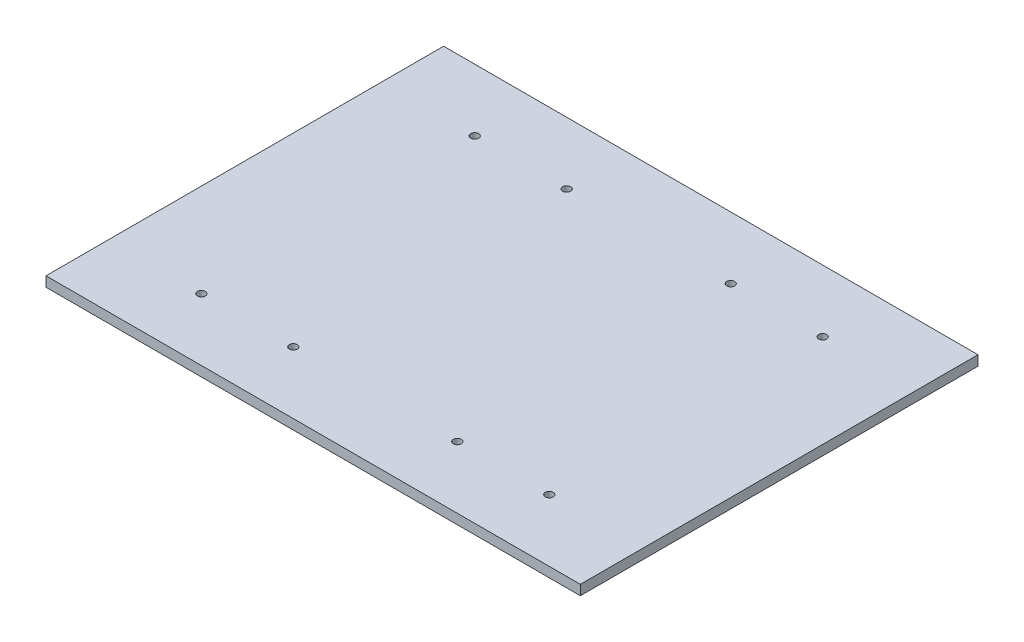
ISO-10303-21;
HEADER;
FILE_DESCRIPTION(('STEP AP214'),'2;1');
FILE_NAME('part.step','',(''),(''),'','','');
FILE_SCHEMA(('AUTOMOTIVE_DESIGN { 1 0 10303 214 1 1 1 1 }'));
ENDSEC;
DATA;
#1=APPLICATION_CONTEXT('core data for automotive mechanical design processes');
#2=APPLICATION_PROTOCOL_DEFINITION('international standard','automotive_design',2000,#1);
#3=PRODUCT_CONTEXT('',#1,'mechanical');
#4=PRODUCT('Part','Part','',(#3));
#5=PRODUCT_RELATED_PRODUCT_CATEGORY('part','',(#4));
#6=PRODUCT_DEFINITION_FORMATION('','',#4);
#7=PRODUCT_DEFINITION_CONTEXT('part definition',#1,'design');
#8=PRODUCT_DEFINITION('design','',#6,#7);
#9=PRODUCT_DEFINITION_SHAPE('','',#8);
#10=(LENGTH_UNIT() NAMED_UNIT(*) SI_UNIT(.MILLI.,.METRE.));
#11=(NAMED_UNIT(*) PLANE_ANGLE_UNIT() SI_UNIT($,.RADIAN.));
#12=(NAMED_UNIT(*) SI_UNIT($,.STERADIAN.) SOLID_ANGLE_UNIT());
#13=UNCERTAINTY_MEASURE_WITH_UNIT(LENGTH_MEASURE(1.E-05),#10,'distance_accuracy_value','');
#14=(GEOMETRIC_REPRESENTATION_CONTEXT(3) GLOBAL_UNCERTAINTY_ASSIGNED_CONTEXT((#13)) GLOBAL_UNIT_ASSIGNED_CONTEXT((#10,
#11,#12)) REPRESENTATION_CONTEXT('',''));
#15=CARTESIAN_POINT('',(0.,0.,0.));
#16=DIRECTION('',(0.,0.,1.));
#17=DIRECTION('',(1.,0.,0.));
#18=AXIS2_PLACEMENT_3D('',#15,#16,#17);
#19=CARTESIAN_POINT('',(-107.5,3.99999999999999,80.));
#20=DIRECTION('',(0.,0.,-1.));
#21=DIRECTION('',(-1.,0.,0.));
#22=AXIS2_PLACEMENT_3D('',#19,#20,#21);
#23=PLANE('',#22);
#24=DIRECTION('',(1.,0.,0.));
#25=VECTOR('',#24,1.);
#26=CARTESIAN_POINT('',(-107.5,0.,80.));
#27=LINE('',#26,#25);
#28=CARTESIAN_POINT('',(-107.5,0.,80.));
#29=VERTEX_POINT('',#28);
#30=CARTESIAN_POINT('',(107.5,0.,80.));
#31=VERTEX_POINT('',#30);
#32=EDGE_CURVE('E112',#29,#31,#27,.T.);
#33=ORIENTED_EDGE('',*,*,#32,.T.);
#34=DIRECTION('',(0.,-1.,0.));
#35=VECTOR('',#34,1.);
#36=CARTESIAN_POINT('',(107.5,3.99999999999999,80.));
#37=LINE('',#36,#35);
#38=CARTESIAN_POINT('',(107.5,3.99999999999999,80.));
#39=VERTEX_POINT('',#38);
#40=EDGE_CURVE('E11',#39,#31,#37,.T.);
#41=ORIENTED_EDGE('',*,*,#40,.F.);
#42=DIRECTION('',(1.,0.,0.));
#43=VECTOR('',#42,1.);
#44=CARTESIAN_POINT('',(-107.5,3.99999999999999,80.));
#45=LINE('',#44,#43);
#46=CARTESIAN_POINT('',(-107.5,3.99999999999999,80.));
#47=VERTEX_POINT('',#46);
#48=EDGE_CURVE('E85',#47,#39,#45,.T.);
#49=ORIENTED_EDGE('',*,*,#48,.F.);
#50=DIRECTION('',(0.,-1.,0.));
#51=VECTOR('',#50,1.);
#52=CARTESIAN_POINT('',(-107.5,3.99999999999999,80.));
#53=LINE('',#52,#51);
#54=EDGE_CURVE('E108',#47,#29,#53,.T.);
#55=ORIENTED_EDGE('',*,*,#54,.T.);
#56=EDGE_LOOP('',(#33,#41,#49,#55));
#57=FACE_BOUND('',#56,.T.);
#58=ADVANCED_FACE('F45',(#57),#23,.F.);
#59=CARTESIAN_POINT('',(107.5,3.99999999999999,-80.));
#60=DIRECTION('',(1.,0.,0.));
#61=DIRECTION('',(0.,0.,-1.));
#62=AXIS2_PLACEMENT_3D('',#59,#60,#61);
#63=PLANE('',#62);
#64=DIRECTION('',(0.,0.,1.));
#65=VECTOR('',#64,1.);
#66=CARTESIAN_POINT('',(107.5,0.,-80.));
#67=LINE('',#66,#65);
#68=CARTESIAN_POINT('',(107.5,0.,-80.));
#69=VERTEX_POINT('',#68);
#70=EDGE_CURVE('E94',#69,#31,#67,.T.);
#71=ORIENTED_EDGE('',*,*,#70,.F.);
#72=DIRECTION('',(0.,-1.,0.));
#73=VECTOR('',#72,1.);
#74=CARTESIAN_POINT('',(107.5,3.99999999999999,-80.));
#75=LINE('',#74,#73);
#76=CARTESIAN_POINT('',(107.5,3.99999999999999,-80.));
#77=VERTEX_POINT('',#76);
#78=EDGE_CURVE('E54',#77,#69,#75,.T.);
#79=ORIENTED_EDGE('',*,*,#78,.F.);
#80=DIRECTION('',(0.,0.,1.));
#81=VECTOR('',#80,1.);
#82=CARTESIAN_POINT('',(107.5,3.99999999999999,-80.));
#83=LINE('',#82,#81);
#84=EDGE_CURVE('E92',#77,#39,#83,.T.);
#85=ORIENTED_EDGE('',*,*,#84,.T.);
#86=ORIENTED_EDGE('',*,*,#40,.T.);
#87=EDGE_LOOP('',(#71,#79,#85,#86));
#88=FACE_BOUND('',#87,.T.);
#89=ADVANCED_FACE('F91',(#88),#63,.T.);
#90=CARTESIAN_POINT('',(-107.5,3.99999999999999,-80.));
#91=DIRECTION('',(0.,0.,-1.));
#92=DIRECTION('',(-1.,0.,0.));
#93=AXIS2_PLACEMENT_3D('',#90,#91,#92);
#94=PLANE('',#93);
#95=DIRECTION('',(1.,0.,0.));
#96=VECTOR('',#95,1.);
#97=CARTESIAN_POINT('',(-107.5,0.,-80.));
#98=LINE('',#97,#96);
#99=CARTESIAN_POINT('',(-107.5,0.,-80.));
#100=VERTEX_POINT('',#99);
#101=EDGE_CURVE('E119',#100,#69,#98,.T.);
#102=ORIENTED_EDGE('',*,*,#101,.F.);
#103=DIRECTION('',(0.,-1.,0.));
#104=VECTOR('',#103,1.);
#105=CARTESIAN_POINT('',(-107.5,3.99999999999999,-80.));
#106=LINE('',#105,#104);
#107=CARTESIAN_POINT('',(-107.5,3.99999999999999,-80.));
#108=VERTEX_POINT('',#107);
#109=EDGE_CURVE('E77',#108,#100,#106,.T.);
#110=ORIENTED_EDGE('',*,*,#109,.F.);
#111=DIRECTION('',(1.,0.,0.));
#112=VECTOR('',#111,1.);
#113=CARTESIAN_POINT('',(-107.5,3.99999999999999,-80.));
#114=LINE('',#113,#112);
#115=EDGE_CURVE('E101',#108,#77,#114,.T.);
#116=ORIENTED_EDGE('',*,*,#115,.T.);
#117=ORIENTED_EDGE('',*,*,#78,.T.);
#118=EDGE_LOOP('',(#102,#110,#116,#117));
#119=FACE_BOUND('',#118,.T.);
#120=ADVANCED_FACE('F104',(#119),#94,.T.);
#121=CARTESIAN_POINT('',(-107.5,3.99999999999999,-80.));
#122=DIRECTION('',(1.,0.,0.));
#123=DIRECTION('',(0.,0.,-1.));
#124=AXIS2_PLACEMENT_3D('',#121,#122,#123);
#125=PLANE('',#124);
#126=DIRECTION('',(0.,0.,1.));
#127=VECTOR('',#126,1.);
#128=CARTESIAN_POINT('',(-107.5,0.,-80.));
#129=LINE('',#128,#127);
#130=EDGE_CURVE('E80',#100,#29,#129,.T.);
#131=ORIENTED_EDGE('',*,*,#130,.T.);
#132=ORIENTED_EDGE('',*,*,#54,.F.);
#133=DIRECTION('',(0.,0.,1.));
#134=VECTOR('',#133,1.);
#135=CARTESIAN_POINT('',(-107.5,3.99999999999999,-80.));
#136=LINE('',#135,#134);
#137=EDGE_CURVE('E62',#108,#47,#136,.T.);
#138=ORIENTED_EDGE('',*,*,#137,.F.);
#139=ORIENTED_EDGE('',*,*,#109,.T.);
#140=EDGE_LOOP('',(#131,#132,#138,#139));
#141=FACE_BOUND('',#140,.T.);
#142=ADVANCED_FACE('F142',(#141),#125,.F.);
#143=CARTESIAN_POINT('',(0.,3.99999999999999,0.));
#144=DIRECTION('',(0.,-1.,0.));
#145=DIRECTION('',(0.,0.,-1.));
#146=AXIS2_PLACEMENT_3D('',#143,#144,#145);
#147=PLANE('',#146);
#148=CARTESIAN_POINT('',(-70.,3.99999999999999,55.));
#149=DIRECTION('',(0.,-1.,0.));
#150=DIRECTION('',(0.,0.,-1.));
#151=AXIS2_PLACEMENT_3D('',#148,#149,#150);
#152=CIRCLE('',#151,1.6);
#153=CARTESIAN_POINT('',(-70.,3.99999999999999,53.4));
#154=VERTEX_POINT('',#153);
#155=EDGE_CURVE('E252',#154,#154,#152,.T.);
#156=ORIENTED_EDGE('',*,*,#155,.T.);
#157=EDGE_LOOP('',(#156));
#158=FACE_BOUND('',#157,.T.);
#159=CARTESIAN_POINT('',(33.,3.99999999999999,55.));
#160=DIRECTION('',(0.,-1.,0.));
#161=DIRECTION('',(0.,0.,-1.));
#162=AXIS2_PLACEMENT_3D('',#159,#160,#161);
#163=CIRCLE('',#162,1.6);
#164=CARTESIAN_POINT('',(33.,3.99999999999999,53.4));
#165=VERTEX_POINT('',#164);
#166=EDGE_CURVE('E264',#165,#165,#163,.T.);
#167=ORIENTED_EDGE('',*,*,#166,.T.);
#168=EDGE_LOOP('',(#167));
#169=FACE_BOUND('',#168,.T.);
#170=CARTESIAN_POINT('',(-33.,3.99999999999999,55.));
#171=DIRECTION('',(0.,-1.,0.));
#172=DIRECTION('',(0.,0.,-1.));
#173=AXIS2_PLACEMENT_3D('',#170,#171,#172);
#174=CIRCLE('',#173,1.6);
#175=CARTESIAN_POINT('',(-33.,3.99999999999999,53.4));
#176=VERTEX_POINT('',#175);
#177=EDGE_CURVE('E272',#176,#176,#174,.T.);
#178=ORIENTED_EDGE('',*,*,#177,.T.);
#179=EDGE_LOOP('',(#178));
#180=FACE_BOUND('',#179,.T.);
#181=CARTESIAN_POINT('',(70.,3.99999999999999,55.));
#182=DIRECTION('',(0.,-1.,0.));
#183=DIRECTION('',(0.,0.,-1.));
#184=AXIS2_PLACEMENT_3D('',#181,#182,#183);
#185=CIRCLE('',#184,1.6);
#186=CARTESIAN_POINT('',(70.,3.99999999999999,53.4));
#187=VERTEX_POINT('',#186);
#188=EDGE_CURVE('E280',#187,#187,#185,.T.);
#189=ORIENTED_EDGE('',*,*,#188,.T.);
#190=EDGE_LOOP('',(#189));
#191=FACE_BOUND('',#190,.T.);
#192=CARTESIAN_POINT('',(70.,3.99999999999999,-55.));
#193=DIRECTION('',(0.,-1.,0.));
#194=DIRECTION('',(0.,0.,-1.));
#195=AXIS2_PLACEMENT_3D('',#192,#193,#194);
#196=CIRCLE('',#195,1.6);
#197=CARTESIAN_POINT('',(70.,3.99999999999999,-56.6));
#198=VERTEX_POINT('',#197);
#199=EDGE_CURVE('E288',#198,#198,#196,.T.);
#200=ORIENTED_EDGE('',*,*,#199,.T.);
#201=EDGE_LOOP('',(#200));
#202=FACE_BOUND('',#201,.T.);
#203=CARTESIAN_POINT('',(33.,3.99999999999999,-55.));
#204=DIRECTION('',(0.,-1.,0.));
#205=DIRECTION('',(0.,0.,-1.));
#206=AXIS2_PLACEMENT_3D('',#203,#204,#205);
#207=CIRCLE('',#206,1.6);
#208=CARTESIAN_POINT('',(33.,3.99999999999999,-56.6));
#209=VERTEX_POINT('',#208);
#210=EDGE_CURVE('E296',#209,#209,#207,.T.);
#211=ORIENTED_EDGE('',*,*,#210,.T.);
#212=EDGE_LOOP('',(#211));
#213=FACE_BOUND('',#212,.T.);
#214=CARTESIAN_POINT('',(-33.,3.99999999999999,-55.));
#215=DIRECTION('',(0.,-1.,0.));
#216=DIRECTION('',(0.,0.,-1.));
#217=AXIS2_PLACEMENT_3D('',#214,#215,#216);
#218=CIRCLE('',#217,1.6);
#219=CARTESIAN_POINT('',(-33.,3.99999999999999,-56.6));
#220=VERTEX_POINT('',#219);
#221=EDGE_CURVE('E304',#220,#220,#218,.T.);
#222=ORIENTED_EDGE('',*,*,#221,.T.);
#223=EDGE_LOOP('',(#222));
#224=FACE_BOUND('',#223,.T.);
#225=CARTESIAN_POINT('',(-70.,3.99999999999999,-55.));
#226=DIRECTION('',(0.,-1.,0.));
#227=DIRECTION('',(0.,0.,-1.));
#228=AXIS2_PLACEMENT_3D('',#225,#226,#227);
#229=CIRCLE('',#228,1.6);
#230=CARTESIAN_POINT('',(-70.,3.99999999999999,-56.6));
#231=VERTEX_POINT('',#230);
#232=EDGE_CURVE('E116',#231,#231,#229,.T.);
#233=ORIENTED_EDGE('',*,*,#232,.T.);
#234=EDGE_LOOP('',(#233));
#235=FACE_BOUND('',#234,.T.);
#236=ORIENTED_EDGE('',*,*,#48,.T.);
#237=ORIENTED_EDGE('',*,*,#84,.F.);
#238=ORIENTED_EDGE('',*,*,#115,.F.);
#239=ORIENTED_EDGE('',*,*,#137,.T.);
#240=EDGE_LOOP('',(#236,#237,#238,#239));
#241=FACE_BOUND('',#240,.T.);
#242=ADVANCED_FACE('F100',(#158,#169,#180,#191,#202,#213,#224,#235,#241),#147,.F.);
#243=CARTESIAN_POINT('',(0.,0.,0.));
#244=DIRECTION('',(0.,-1.,0.));
#245=DIRECTION('',(0.,0.,-1.));
#246=AXIS2_PLACEMENT_3D('',#243,#244,#245);
#247=PLANE('',#246);
#248=CARTESIAN_POINT('',(-70.,0.,55.));
#249=DIRECTION('',(0.,-1.,0.));
#250=DIRECTION('',(0.,0.,-1.));
#251=AXIS2_PLACEMENT_3D('',#248,#249,#250);
#252=CIRCLE('',#251,1.6);
#253=CARTESIAN_POINT('',(-70.,0.,53.4));
#254=VERTEX_POINT('',#253);
#255=EDGE_CURVE('E254',#254,#254,#252,.T.);
#256=ORIENTED_EDGE('',*,*,#255,.F.);
#257=EDGE_LOOP('',(#256));
#258=FACE_BOUND('',#257,.T.);
#259=CARTESIAN_POINT('',(33.,0.,55.));
#260=DIRECTION('',(0.,-1.,0.));
#261=DIRECTION('',(0.,0.,-1.));
#262=AXIS2_PLACEMENT_3D('',#259,#260,#261);
#263=CIRCLE('',#262,1.6);
#264=CARTESIAN_POINT('',(33.,0.,53.4));
#265=VERTEX_POINT('',#264);
#266=EDGE_CURVE('E258',#265,#265,#263,.T.);
#267=ORIENTED_EDGE('',*,*,#266,.F.);
#268=EDGE_LOOP('',(#267));
#269=FACE_BOUND('',#268,.T.);
#270=CARTESIAN_POINT('',(-33.,0.,55.));
#271=DIRECTION('',(0.,-1.,0.));
#272=DIRECTION('',(0.,0.,-1.));
#273=AXIS2_PLACEMENT_3D('',#270,#271,#272);
#274=CIRCLE('',#273,1.6);
#275=CARTESIAN_POINT('',(-33.,0.,53.4));
#276=VERTEX_POINT('',#275);
#277=EDGE_CURVE('E268',#276,#276,#274,.T.);
#278=ORIENTED_EDGE('',*,*,#277,.F.);
#279=EDGE_LOOP('',(#278));
#280=FACE_BOUND('',#279,.T.);
#281=CARTESIAN_POINT('',(70.,0.,55.));
#282=DIRECTION('',(0.,-1.,0.));
#283=DIRECTION('',(0.,0.,-1.));
#284=AXIS2_PLACEMENT_3D('',#281,#282,#283);
#285=CIRCLE('',#284,1.6);
#286=CARTESIAN_POINT('',(70.,0.,53.4));
#287=VERTEX_POINT('',#286);
#288=EDGE_CURVE('E276',#287,#287,#285,.T.);
#289=ORIENTED_EDGE('',*,*,#288,.F.);
#290=EDGE_LOOP('',(#289));
#291=FACE_BOUND('',#290,.T.);
#292=CARTESIAN_POINT('',(70.,0.,-55.));
#293=DIRECTION('',(0.,-1.,0.));
#294=DIRECTION('',(0.,0.,-1.));
#295=AXIS2_PLACEMENT_3D('',#292,#293,#294);
#296=CIRCLE('',#295,1.6);
#297=CARTESIAN_POINT('',(70.,0.,-56.6));
#298=VERTEX_POINT('',#297);
#299=EDGE_CURVE('E284',#298,#298,#296,.T.);
#300=ORIENTED_EDGE('',*,*,#299,.F.);
#301=EDGE_LOOP('',(#300));
#302=FACE_BOUND('',#301,.T.);
#303=CARTESIAN_POINT('',(33.,0.,-55.));
#304=DIRECTION('',(0.,-1.,0.));
#305=DIRECTION('',(0.,0.,-1.));
#306=AXIS2_PLACEMENT_3D('',#303,#304,#305);
#307=CIRCLE('',#306,1.6);
#308=CARTESIAN_POINT('',(33.,0.,-56.6));
#309=VERTEX_POINT('',#308);
#310=EDGE_CURVE('E292',#309,#309,#307,.T.);
#311=ORIENTED_EDGE('',*,*,#310,.F.);
#312=EDGE_LOOP('',(#311));
#313=FACE_BOUND('',#312,.T.);
#314=CARTESIAN_POINT('',(-33.,0.,-55.));
#315=DIRECTION('',(0.,-1.,0.));
#316=DIRECTION('',(0.,0.,-1.));
#317=AXIS2_PLACEMENT_3D('',#314,#315,#316);
#318=CIRCLE('',#317,1.6);
#319=CARTESIAN_POINT('',(-33.,0.,-56.6));
#320=VERTEX_POINT('',#319);
#321=EDGE_CURVE('E300',#320,#320,#318,.T.);
#322=ORIENTED_EDGE('',*,*,#321,.F.);
#323=EDGE_LOOP('',(#322));
#324=FACE_BOUND('',#323,.T.);
#325=CARTESIAN_POINT('',(-70.,0.,-55.));
#326=DIRECTION('',(0.,-1.,0.));
#327=DIRECTION('',(0.,0.,-1.));
#328=AXIS2_PLACEMENT_3D('',#325,#326,#327);
#329=CIRCLE('',#328,1.6);
#330=CARTESIAN_POINT('',(-70.,0.,-56.6));
#331=VERTEX_POINT('',#330);
#332=EDGE_CURVE('E308',#331,#331,#329,.T.);
#333=ORIENTED_EDGE('',*,*,#332,.F.);
#334=EDGE_LOOP('',(#333));
#335=FACE_BOUND('',#334,.T.);
#336=ORIENTED_EDGE('',*,*,#32,.F.);
#337=ORIENTED_EDGE('',*,*,#130,.F.);
#338=ORIENTED_EDGE('',*,*,#101,.T.);
#339=ORIENTED_EDGE('',*,*,#70,.T.);
#340=EDGE_LOOP('',(#336,#337,#338,#339));
#341=FACE_BOUND('',#340,.T.);
#342=ADVANCED_FACE('F130',(#258,#269,#280,#291,#302,#313,#324,#335,#341),#247,.T.);
#343=CARTESIAN_POINT('',(-70.,0.,-55.));
#344=DIRECTION('',(0.,-1.,0.));
#345=DIRECTION('',(0.,0.,-1.));
#346=AXIS2_PLACEMENT_3D('',#343,#344,#345);
#347=CYLINDRICAL_SURFACE('',#346,1.6);
#348=ORIENTED_EDGE('',*,*,#232,.F.);
#349=EDGE_LOOP('',(#348));
#350=FACE_BOUND('',#349,.T.);
#351=ORIENTED_EDGE('',*,*,#332,.T.);
#352=EDGE_LOOP('',(#351));
#353=FACE_BOUND('',#352,.T.);
#354=ADVANCED_FACE('F132',(#350,#353),#347,.F.);
#355=CARTESIAN_POINT('',(-33.,0.,-55.));
#356=DIRECTION('',(0.,-1.,0.));
#357=DIRECTION('',(0.,0.,-1.));
#358=AXIS2_PLACEMENT_3D('',#355,#356,#357);
#359=CYLINDRICAL_SURFACE('',#358,1.6);
#360=ORIENTED_EDGE('',*,*,#221,.F.);
#361=EDGE_LOOP('',(#360));
#362=FACE_BOUND('',#361,.T.);
#363=ORIENTED_EDGE('',*,*,#321,.T.);
#364=EDGE_LOOP('',(#363));
#365=FACE_BOUND('',#364,.T.);
#366=ADVANCED_FACE('F139',(#362,#365),#359,.F.);
#367=CARTESIAN_POINT('',(33.,0.,-55.));
#368=DIRECTION('',(0.,-1.,0.));
#369=DIRECTION('',(0.,0.,-1.));
#370=AXIS2_PLACEMENT_3D('',#367,#368,#369);
#371=CYLINDRICAL_SURFACE('',#370,1.6);
#372=ORIENTED_EDGE('',*,*,#210,.F.);
#373=EDGE_LOOP('',(#372));
#374=FACE_BOUND('',#373,.T.);
#375=ORIENTED_EDGE('',*,*,#310,.T.);
#376=EDGE_LOOP('',(#375));
#377=FACE_BOUND('',#376,.T.);
#378=ADVANCED_FACE('F186',(#374,#377),#371,.F.);
#379=CARTESIAN_POINT('',(70.,0.,-55.));
#380=DIRECTION('',(0.,-1.,0.));
#381=DIRECTION('',(0.,0.,-1.));
#382=AXIS2_PLACEMENT_3D('',#379,#380,#381);
#383=CYLINDRICAL_SURFACE('',#382,1.6);
#384=ORIENTED_EDGE('',*,*,#199,.F.);
#385=EDGE_LOOP('',(#384));
#386=FACE_BOUND('',#385,.T.);
#387=ORIENTED_EDGE('',*,*,#299,.T.);
#388=EDGE_LOOP('',(#387));
#389=FACE_BOUND('',#388,.T.);
#390=ADVANCED_FACE('F196',(#386,#389),#383,.F.);
#391=CARTESIAN_POINT('',(70.,0.,55.));
#392=DIRECTION('',(0.,-1.,0.));
#393=DIRECTION('',(0.,0.,-1.));
#394=AXIS2_PLACEMENT_3D('',#391,#392,#393);
#395=CYLINDRICAL_SURFACE('',#394,1.6);
#396=ORIENTED_EDGE('',*,*,#188,.F.);
#397=EDGE_LOOP('',(#396));
#398=FACE_BOUND('',#397,.T.);
#399=ORIENTED_EDGE('',*,*,#288,.T.);
#400=EDGE_LOOP('',(#399));
#401=FACE_BOUND('',#400,.T.);
#402=ADVANCED_FACE('F206',(#398,#401),#395,.F.);
#403=CARTESIAN_POINT('',(-33.,0.,55.));
#404=DIRECTION('',(0.,-1.,0.));
#405=DIRECTION('',(0.,0.,-1.));
#406=AXIS2_PLACEMENT_3D('',#403,#404,#405);
#407=CYLINDRICAL_SURFACE('',#406,1.6);
#408=ORIENTED_EDGE('',*,*,#177,.F.);
#409=EDGE_LOOP('',(#408));
#410=FACE_BOUND('',#409,.T.);
#411=ORIENTED_EDGE('',*,*,#277,.T.);
#412=EDGE_LOOP('',(#411));
#413=FACE_BOUND('',#412,.T.);
#414=ADVANCED_FACE('F216',(#410,#413),#407,.F.);
#415=CARTESIAN_POINT('',(33.,0.,55.));
#416=DIRECTION('',(0.,-1.,0.));
#417=DIRECTION('',(0.,0.,-1.));
#418=AXIS2_PLACEMENT_3D('',#415,#416,#417);
#419=CYLINDRICAL_SURFACE('',#418,1.6);
#420=ORIENTED_EDGE('',*,*,#166,.F.);
#421=EDGE_LOOP('',(#420));
#422=FACE_BOUND('',#421,.T.);
#423=ORIENTED_EDGE('',*,*,#266,.T.);
#424=EDGE_LOOP('',(#423));
#425=FACE_BOUND('',#424,.T.);
#426=ADVANCED_FACE('F226',(#422,#425),#419,.F.);
#427=CARTESIAN_POINT('',(-70.,0.,55.));
#428=DIRECTION('',(0.,-1.,0.));
#429=DIRECTION('',(0.,0.,-1.));
#430=AXIS2_PLACEMENT_3D('',#427,#428,#429);
#431=CYLINDRICAL_SURFACE('',#430,1.6);
#432=ORIENTED_EDGE('',*,*,#155,.F.);
#433=EDGE_LOOP('',(#432));
#434=FACE_BOUND('',#433,.T.);
#435=ORIENTED_EDGE('',*,*,#255,.T.);
#436=EDGE_LOOP('',(#435));
#437=FACE_BOUND('',#436,.T.);
#438=ADVANCED_FACE('F236',(#434,#437),#431,.F.);
#439=CLOSED_SHELL('',(#58,#89,#120,#142,#242,#342,#354,#366,#378,#390,#402,#414,#426,#438));
#440=MANIFOLD_SOLID_BREP('B2',#439);
#441=ADVANCED_BREP_SHAPE_REPRESENTATION('',(#18,#440),#14);
#442=SHAPE_DEFINITION_REPRESENTATION(#9,#441);
ENDSEC;
END-ISO-10303-21;
